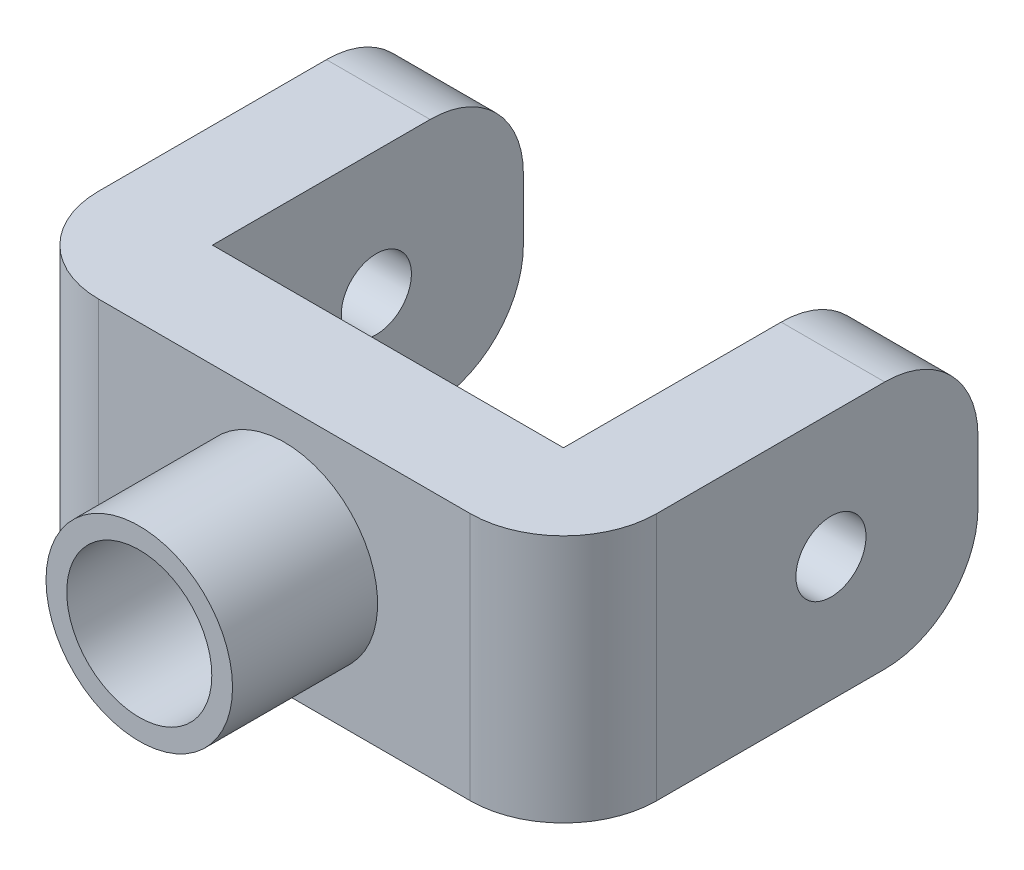
ISO-10303-21;
HEADER;
FILE_DESCRIPTION(('STEP AP214'),'2;1');
FILE_NAME('part.step','',(''),(''),'','','');
FILE_SCHEMA(('AUTOMOTIVE_DESIGN { 1 0 10303 214 1 1 1 1 }'));
ENDSEC;
DATA;
#1=APPLICATION_CONTEXT('core data for automotive mechanical design processes');
#2=APPLICATION_PROTOCOL_DEFINITION('international standard','automotive_design',2000,#1);
#3=PRODUCT_CONTEXT('',#1,'mechanical');
#4=PRODUCT('Part','Part','',(#3));
#5=PRODUCT_RELATED_PRODUCT_CATEGORY('part','',(#4));
#6=PRODUCT_DEFINITION_FORMATION('','',#4);
#7=PRODUCT_DEFINITION_CONTEXT('part definition',#1,'design');
#8=PRODUCT_DEFINITION('design','',#6,#7);
#9=PRODUCT_DEFINITION_SHAPE('','',#8);
#10=(LENGTH_UNIT() NAMED_UNIT(*) SI_UNIT(.MILLI.,.METRE.));
#11=(NAMED_UNIT(*) PLANE_ANGLE_UNIT() SI_UNIT($,.RADIAN.));
#12=(NAMED_UNIT(*) SI_UNIT($,.STERADIAN.) SOLID_ANGLE_UNIT());
#13=UNCERTAINTY_MEASURE_WITH_UNIT(LENGTH_MEASURE(1.E-05),#10,'distance_accuracy_value','');
#14=(GEOMETRIC_REPRESENTATION_CONTEXT(3) GLOBAL_UNCERTAINTY_ASSIGNED_CONTEXT((#13)) GLOBAL_UNIT_ASSIGNED_CONTEXT((#10,
#11,#12)) REPRESENTATION_CONTEXT('',''));
#15=CARTESIAN_POINT('',(0.,0.,0.));
#16=DIRECTION('',(0.,0.,1.));
#17=DIRECTION('',(1.,0.,0.));
#18=AXIS2_PLACEMENT_3D('',#15,#16,#17);
#19=CARTESIAN_POINT('',(26.9354838709678,12.,3.05148045872243));
#20=DIRECTION('',(0.,0.,-1.));
#21=DIRECTION('',(-1.,0.,0.));
#22=AXIS2_PLACEMENT_3D('',#19,#20,#21);
#23=PLANE('',#22);
#24=DIRECTION('',(1.,0.,0.));
#25=VECTOR('',#24,1.);
#26=CARTESIAN_POINT('',(26.9354838709678,12.,3.05148045872243));
#27=LINE('',#26,#25);
#28=CARTESIAN_POINT('',(-17.9354838709678,12.,3.05148045872242));
#29=VERTEX_POINT('',#28);
#30=CARTESIAN_POINT('',(17.9354838709678,12.,3.05148045872243));
#31=VERTEX_POINT('',#30);
#32=EDGE_CURVE('E225',#29,#31,#27,.T.);
#33=ORIENTED_EDGE('',*,*,#32,.F.);
#34=DIRECTION('',(0.,-1.,0.));
#35=VECTOR('',#34,1.);
#36=CARTESIAN_POINT('',(-17.9354838709678,12.,3.05148045872242));
#37=LINE('',#36,#35);
#38=CARTESIAN_POINT('',(-17.9354838709678,-12.,3.05148045872242));
#39=VERTEX_POINT('',#38);
#40=EDGE_CURVE('E215',#29,#39,#37,.T.);
#41=ORIENTED_EDGE('',*,*,#40,.T.);
#42=DIRECTION('',(1.,0.,0.));
#43=VECTOR('',#42,1.);
#44=CARTESIAN_POINT('',(26.9354838709678,-12.,3.05148045872243));
#45=LINE('',#44,#43);
#46=CARTESIAN_POINT('',(17.9354838709678,-12.,3.05148045872243));
#47=VERTEX_POINT('',#46);
#48=EDGE_CURVE('E242',#39,#47,#45,.T.);
#49=ORIENTED_EDGE('',*,*,#48,.T.);
#50=DIRECTION('',(0.,-1.,0.));
#51=VECTOR('',#50,1.);
#52=CARTESIAN_POINT('',(17.9354838709678,12.,3.05148045872243));
#53=LINE('',#52,#51);
#54=EDGE_CURVE('E213',#47,#31,#53,.F.);
#55=ORIENTED_EDGE('',*,*,#54,.T.);
#56=EDGE_LOOP('',(#33,#41,#49,#55));
#57=FACE_BOUND('',#56,.T.);
#58=CARTESIAN_POINT('',(0.,0.,3.05148045872243));
#59=DIRECTION('',(0.,0.,-1.));
#60=DIRECTION('',(-1.,0.,0.));
#61=AXIS2_PLACEMENT_3D('',#58,#59,#60);
#62=CIRCLE('',#61,9.);
#63=CARTESIAN_POINT('',(-9.,0.,3.05148045872242));
#64=VERTEX_POINT('',#63);
#65=EDGE_CURVE('E165',#64,#64,#62,.F.);
#66=ORIENTED_EDGE('',*,*,#65,.F.);
#67=EDGE_LOOP('',(#66));
#68=FACE_BOUND('',#67,.T.);
#69=ADVANCED_FACE('F36',(#57,#68),#23,.F.);
#70=CARTESIAN_POINT('',(16.9354838709678,12.,-6.94851954127757));
#71=DIRECTION('',(1.,0.,0.));
#72=DIRECTION('',(0.,0.,-1.));
#73=AXIS2_PLACEMENT_3D('',#70,#71,#72);
#74=PLANE('',#73);
#75=CARTESIAN_POINT('',(16.9354838709678,0.,-22.7618384998148));
#76=DIRECTION('',(1.,0.,0.));
#77=DIRECTION('',(0.,0.,-1.));
#78=AXIS2_PLACEMENT_3D('',#75,#76,#77);
#79=CIRCLE('',#78,3.38243531338169);
#80=CARTESIAN_POINT('',(16.9354838709678,0.,-26.1442738131964));
#81=VERTEX_POINT('',#80);
#82=EDGE_CURVE('E489',#81,#81,#79,.F.);
#83=ORIENTED_EDGE('',*,*,#82,.F.);
#84=EDGE_LOOP('',(#83));
#85=FACE_BOUND('',#84,.T.);
#86=DIRECTION('',(0.,-1.,0.));
#87=VECTOR('',#86,1.);
#88=CARTESIAN_POINT('',(16.9354838709678,12.,-36.9485195412776));
#89=LINE('',#88,#87);
#90=CARTESIAN_POINT('',(16.9354838709678,3.,-36.9485195412776));
#91=VERTEX_POINT('',#90);
#92=CARTESIAN_POINT('',(16.9354838709678,-3.,-36.9485195412776));
#93=VERTEX_POINT('',#92);
#94=EDGE_CURVE('E254',#91,#93,#89,.T.);
#95=ORIENTED_EDGE('',*,*,#94,.T.);
#96=CARTESIAN_POINT('',(16.9354838709678,-3.,-27.9485195412776));
#97=DIRECTION('',(1.,0.,0.));
#98=DIRECTION('',(0.,0.,-1.));
#99=AXIS2_PLACEMENT_3D('',#96,#97,#98);
#100=CIRCLE('',#99,9.);
#101=CARTESIAN_POINT('',(16.9354838709678,-12.,-27.9485195412776));
#102=VERTEX_POINT('',#101);
#103=EDGE_CURVE('E184',#93,#102,#100,.F.);
#104=ORIENTED_EDGE('',*,*,#103,.T.);
#105=DIRECTION('',(0.,0.,1.));
#106=VECTOR('',#105,1.);
#107=CARTESIAN_POINT('',(16.9354838709678,-12.,-6.94851954127757));
#108=LINE('',#107,#106);
#109=CARTESIAN_POINT('',(16.9354838709678,-12.,-6.94851954127757));
#110=VERTEX_POINT('',#109);
#111=EDGE_CURVE('E163',#102,#110,#108,.T.);
#112=ORIENTED_EDGE('',*,*,#111,.T.);
#113=DIRECTION('',(0.,-1.,0.));
#114=VECTOR('',#113,1.);
#115=CARTESIAN_POINT('',(16.9354838709678,12.,-6.94851954127757));
#116=LINE('',#115,#114);
#117=CARTESIAN_POINT('',(16.9354838709678,12.,-6.94851954127757));
#118=VERTEX_POINT('',#117);
#119=EDGE_CURVE('E154',#118,#110,#116,.T.);
#120=ORIENTED_EDGE('',*,*,#119,.F.);
#121=DIRECTION('',(0.,0.,1.));
#122=VECTOR('',#121,1.);
#123=CARTESIAN_POINT('',(16.9354838709678,12.,-6.94851954127757));
#124=LINE('',#123,#122);
#125=CARTESIAN_POINT('',(16.9354838709678,12.,-27.9485195412776));
#126=VERTEX_POINT('',#125);
#127=EDGE_CURVE('E139',#126,#118,#124,.T.);
#128=ORIENTED_EDGE('',*,*,#127,.F.);
#129=CARTESIAN_POINT('',(16.9354838709678,3.,-27.9485195412776));
#130=DIRECTION('',(1.,0.,0.));
#131=DIRECTION('',(0.,0.,-1.));
#132=AXIS2_PLACEMENT_3D('',#129,#130,#131);
#133=CIRCLE('',#132,9.);
#134=EDGE_CURVE('E182',#126,#91,#133,.F.);
#135=ORIENTED_EDGE('',*,*,#134,.T.);
#136=EDGE_LOOP('',(#95,#104,#112,#120,#128,#135));
#137=FACE_BOUND('',#136,.T.);
#138=ADVANCED_FACE('F161',(#85,#137),#74,.F.);
#139=CARTESIAN_POINT('',(-16.9354838709678,12.,-6.94851954127757));
#140=DIRECTION('',(0.,0.,1.));
#141=DIRECTION('',(1.,0.,0.));
#142=AXIS2_PLACEMENT_3D('',#139,#140,#141);
#143=PLANE('',#142);
#144=CARTESIAN_POINT('',(0.,0.,-6.94851954127757));
#145=DIRECTION('',(0.,0.,1.));
#146=DIRECTION('',(1.,0.,0.));
#147=AXIS2_PLACEMENT_3D('',#144,#145,#146);
#148=CIRCLE('',#147,7.);
#149=CARTESIAN_POINT('',(7.,0.,-6.94851954127757));
#150=VERTEX_POINT('',#149);
#151=EDGE_CURVE('E279',#150,#150,#148,.T.);
#152=ORIENTED_EDGE('',*,*,#151,.T.);
#153=EDGE_LOOP('',(#152));
#154=FACE_BOUND('',#153,.T.);
#155=DIRECTION('',(-1.,0.,0.));
#156=VECTOR('',#155,1.);
#157=CARTESIAN_POINT('',(-16.9354838709678,-12.,-6.94851954127757));
#158=LINE('',#157,#156);
#159=CARTESIAN_POINT('',(-16.9354838709678,-12.,-6.94851954127757));
#160=VERTEX_POINT('',#159);
#161=EDGE_CURVE('E249',#110,#160,#158,.T.);
#162=ORIENTED_EDGE('',*,*,#161,.T.);
#163=DIRECTION('',(0.,-1.,0.));
#164=VECTOR('',#163,1.);
#165=CARTESIAN_POINT('',(-16.9354838709678,12.,-6.94851954127757));
#166=LINE('',#165,#164);
#167=CARTESIAN_POINT('',(-16.9354838709678,12.,-6.94851954127757));
#168=VERTEX_POINT('',#167);
#169=EDGE_CURVE('E156',#168,#160,#166,.T.);
#170=ORIENTED_EDGE('',*,*,#169,.F.);
#171=DIRECTION('',(-1.,0.,0.));
#172=VECTOR('',#171,1.);
#173=CARTESIAN_POINT('',(-16.9354838709678,12.,-6.94851954127757));
#174=LINE('',#173,#172);
#175=EDGE_CURVE('E143',#118,#168,#174,.T.);
#176=ORIENTED_EDGE('',*,*,#175,.F.);
#177=ORIENTED_EDGE('',*,*,#119,.T.);
#178=EDGE_LOOP('',(#162,#170,#176,#177));
#179=FACE_BOUND('',#178,.T.);
#180=ADVANCED_FACE('F153',(#154,#179),#143,.F.);
#181=CARTESIAN_POINT('',(-16.9354838709678,12.,-6.94851954127757));
#182=DIRECTION('',(-1.,0.,0.));
#183=DIRECTION('',(0.,0.,1.));
#184=AXIS2_PLACEMENT_3D('',#181,#182,#183);
#185=PLANE('',#184);
#186=CARTESIAN_POINT('',(-16.9354838709678,0.,-22.7618384998147));
#187=DIRECTION('',(-1.,0.,0.));
#188=DIRECTION('',(0.,0.,1.));
#189=AXIS2_PLACEMENT_3D('',#186,#187,#188);
#190=CIRCLE('',#189,3.38243531338169);
#191=CARTESIAN_POINT('',(-16.9354838709678,0.,-19.379403186433));
#192=VERTEX_POINT('',#191);
#193=EDGE_CURVE('E488',#192,#192,#190,.F.);
#194=ORIENTED_EDGE('',*,*,#193,.F.);
#195=EDGE_LOOP('',(#194));
#196=FACE_BOUND('',#195,.T.);
#197=DIRECTION('',(0.,-1.,0.));
#198=VECTOR('',#197,1.);
#199=CARTESIAN_POINT('',(-16.9354838709677,12.,-36.9485195412776));
#200=LINE('',#199,#198);
#201=CARTESIAN_POINT('',(-16.9354838709677,3.,-36.9485195412776));
#202=VERTEX_POINT('',#201);
#203=CARTESIAN_POINT('',(-16.9354838709677,-3.,-36.9485195412776));
#204=VERTEX_POINT('',#203);
#205=EDGE_CURVE('E170',#202,#204,#200,.T.);
#206=ORIENTED_EDGE('',*,*,#205,.F.);
#207=CARTESIAN_POINT('',(-16.9354838709677,3.,-27.9485195412776));
#208=DIRECTION('',(-1.,0.,0.));
#209=DIRECTION('',(0.,0.,1.));
#210=AXIS2_PLACEMENT_3D('',#207,#208,#209);
#211=CIRCLE('',#210,9.);
#212=CARTESIAN_POINT('',(-16.9354838709677,12.,-27.9485195412776));
#213=VERTEX_POINT('',#212);
#214=EDGE_CURVE('E211',#202,#213,#211,.F.);
#215=ORIENTED_EDGE('',*,*,#214,.T.);
#216=DIRECTION('',(0.,0.,-1.));
#217=VECTOR('',#216,1.);
#218=CARTESIAN_POINT('',(-16.9354838709678,12.,-6.94851954127757));
#219=LINE('',#218,#217);
#220=EDGE_CURVE('E158',#168,#213,#219,.T.);
#221=ORIENTED_EDGE('',*,*,#220,.F.);
#222=ORIENTED_EDGE('',*,*,#169,.T.);
#223=DIRECTION('',(0.,0.,-1.));
#224=VECTOR('',#223,1.);
#225=CARTESIAN_POINT('',(-16.9354838709678,-12.,-6.94851954127757));
#226=LINE('',#225,#224);
#227=CARTESIAN_POINT('',(-16.9354838709677,-12.,-27.9485195412776));
#228=VERTEX_POINT('',#227);
#229=EDGE_CURVE('E245',#160,#228,#226,.T.);
#230=ORIENTED_EDGE('',*,*,#229,.T.);
#231=CARTESIAN_POINT('',(-16.9354838709677,-3.,-27.9485195412776));
#232=DIRECTION('',(-1.,0.,0.));
#233=DIRECTION('',(0.,0.,1.));
#234=AXIS2_PLACEMENT_3D('',#231,#232,#233);
#235=CIRCLE('',#234,9.);
#236=EDGE_CURVE('E209',#228,#204,#235,.F.);
#237=ORIENTED_EDGE('',*,*,#236,.T.);
#238=EDGE_LOOP('',(#206,#215,#221,#222,#230,#237));
#239=FACE_BOUND('',#238,.T.);
#240=ADVANCED_FACE('F273',(#196,#239),#185,.F.);
#241=CARTESIAN_POINT('',(-16.9354838709677,12.,-36.9485195412776));
#242=DIRECTION('',(0.,0.,1.));
#243=DIRECTION('',(1.,0.,0.));
#244=AXIS2_PLACEMENT_3D('',#241,#242,#243);
#245=PLANE('',#244);
#246=DIRECTION('',(0.,-1.,0.));
#247=VECTOR('',#246,1.);
#248=CARTESIAN_POINT('',(-26.9354838709677,12.,-36.9485195412776));
#249=LINE('',#248,#247);
#250=CARTESIAN_POINT('',(-26.9354838709677,3.,-36.9485195412776));
#251=VERTEX_POINT('',#250);
#252=CARTESIAN_POINT('',(-26.9354838709677,-3.,-36.9485195412776));
#253=VERTEX_POINT('',#252);
#254=EDGE_CURVE('E259',#251,#253,#249,.T.);
#255=ORIENTED_EDGE('',*,*,#254,.F.);
#256=DIRECTION('',(-1.,0.,0.));
#257=VECTOR('',#256,1.);
#258=CARTESIAN_POINT('',(-16.9354838709677,3.,-36.9485195412776));
#259=LINE('',#258,#257);
#260=EDGE_CURVE('E207',#251,#202,#259,.F.);
#261=ORIENTED_EDGE('',*,*,#260,.T.);
#262=ORIENTED_EDGE('',*,*,#205,.T.);
#263=DIRECTION('',(-1.,0.,0.));
#264=VECTOR('',#263,1.);
#265=CARTESIAN_POINT('',(-26.9354838709677,-3.,-36.9485195412776));
#266=LINE('',#265,#264);
#267=EDGE_CURVE('E204',#204,#253,#266,.T.);
#268=ORIENTED_EDGE('',*,*,#267,.T.);
#269=EDGE_LOOP('',(#255,#261,#262,#268));
#270=FACE_BOUND('',#269,.T.);
#271=ADVANCED_FACE('F265',(#270),#245,.F.);
#272=CARTESIAN_POINT('',(-26.9354838709677,12.,-36.9485195412776));
#273=DIRECTION('',(1.,0.,0.));
#274=DIRECTION('',(0.,0.,-1.));
#275=AXIS2_PLACEMENT_3D('',#272,#273,#274);
#276=PLANE('',#275);
#277=CARTESIAN_POINT('',(-26.9354838709678,0.,-22.7618384998147));
#278=DIRECTION('',(1.,0.,0.));
#279=DIRECTION('',(0.,0.,-1.));
#280=AXIS2_PLACEMENT_3D('',#277,#278,#279);
#281=CIRCLE('',#280,3.38243531338169);
#282=CARTESIAN_POINT('',(-26.9354838709678,0.,-26.1442738131964));
#283=VERTEX_POINT('',#282);
#284=EDGE_CURVE('E177',#283,#283,#281,.F.);
#285=ORIENTED_EDGE('',*,*,#284,.F.);
#286=EDGE_LOOP('',(#285));
#287=FACE_BOUND('',#286,.T.);
#288=DIRECTION('',(0.,0.,1.));
#289=VECTOR('',#288,1.);
#290=CARTESIAN_POINT('',(-26.9354838709677,-12.,-36.9485195412776));
#291=LINE('',#290,#289);
#292=CARTESIAN_POINT('',(-26.9354838709677,-12.,-27.9485195412776));
#293=VERTEX_POINT('',#292);
#294=CARTESIAN_POINT('',(-26.9354838709678,-12.,-5.94851954127758));
#295=VERTEX_POINT('',#294);
#296=EDGE_CURVE('E240',#293,#295,#291,.T.);
#297=ORIENTED_EDGE('',*,*,#296,.T.);
#298=DIRECTION('',(0.,-1.,0.));
#299=VECTOR('',#298,1.);
#300=CARTESIAN_POINT('',(-26.9354838709678,12.,-5.94851954127758));
#301=LINE('',#300,#299);
#302=CARTESIAN_POINT('',(-26.9354838709678,12.,-5.94851954127758));
#303=VERTEX_POINT('',#302);
#304=EDGE_CURVE('E59',#295,#303,#301,.F.);
#305=ORIENTED_EDGE('',*,*,#304,.T.);
#306=DIRECTION('',(0.,0.,1.));
#307=VECTOR('',#306,1.);
#308=CARTESIAN_POINT('',(-26.9354838709677,12.,-36.9485195412776));
#309=LINE('',#308,#307);
#310=CARTESIAN_POINT('',(-26.9354838709677,12.,-27.9485195412776));
#311=VERTEX_POINT('',#310);
#312=EDGE_CURVE('E226',#311,#303,#309,.T.);
#313=ORIENTED_EDGE('',*,*,#312,.F.);
#314=CARTESIAN_POINT('',(-26.9354838709677,3.,-27.9485195412776));
#315=DIRECTION('',(1.,0.,0.));
#316=DIRECTION('',(0.,0.,-1.));
#317=AXIS2_PLACEMENT_3D('',#314,#315,#316);
#318=CIRCLE('',#317,9.);
#319=EDGE_CURVE('E202',#311,#251,#318,.F.);
#320=ORIENTED_EDGE('',*,*,#319,.T.);
#321=ORIENTED_EDGE('',*,*,#254,.T.);
#322=CARTESIAN_POINT('',(-26.9354838709678,-3.,-27.9485195412776));
#323=DIRECTION('',(1.,0.,0.));
#324=DIRECTION('',(0.,0.,-1.));
#325=AXIS2_PLACEMENT_3D('',#322,#323,#324);
#326=CIRCLE('',#325,9.);
#327=EDGE_CURVE('E200',#253,#293,#326,.F.);
#328=ORIENTED_EDGE('',*,*,#327,.T.);
#329=EDGE_LOOP('',(#297,#305,#313,#320,#321,#328));
#330=FACE_BOUND('',#329,.T.);
#331=ADVANCED_FACE('F243',(#287,#330),#276,.F.);
#332=CARTESIAN_POINT('',(26.9354838709677,12.,-36.9485195412776));
#333=DIRECTION('',(-1.,0.,0.));
#334=DIRECTION('',(0.,0.,1.));
#335=AXIS2_PLACEMENT_3D('',#332,#333,#334);
#336=PLANE('',#335);
#337=CARTESIAN_POINT('',(26.9354838709678,0.,-22.7618384998148));
#338=DIRECTION('',(-1.,0.,0.));
#339=DIRECTION('',(0.,0.,1.));
#340=AXIS2_PLACEMENT_3D('',#337,#338,#339);
#341=CIRCLE('',#340,3.38243531338169);
#342=CARTESIAN_POINT('',(26.9354838709678,0.,-19.3794031864331));
#343=VERTEX_POINT('',#342);
#344=EDGE_CURVE('E174',#343,#343,#341,.F.);
#345=ORIENTED_EDGE('',*,*,#344,.F.);
#346=EDGE_LOOP('',(#345));
#347=FACE_BOUND('',#346,.T.);
#348=DIRECTION('',(0.,0.,-1.));
#349=VECTOR('',#348,1.);
#350=CARTESIAN_POINT('',(26.9354838709677,12.,-36.9485195412776));
#351=LINE('',#350,#349);
#352=CARTESIAN_POINT('',(26.9354838709678,12.,-5.94851954127757));
#353=VERTEX_POINT('',#352);
#354=CARTESIAN_POINT('',(26.9354838709677,12.,-27.9485195412776));
#355=VERTEX_POINT('',#354);
#356=EDGE_CURVE('E234',#353,#355,#351,.T.);
#357=ORIENTED_EDGE('',*,*,#356,.F.);
#358=DIRECTION('',(0.,-1.,0.));
#359=VECTOR('',#358,1.);
#360=CARTESIAN_POINT('',(26.9354838709678,12.,-5.94851954127757));
#361=LINE('',#360,#359);
#362=CARTESIAN_POINT('',(26.9354838709678,-12.,-5.94851954127757));
#363=VERTEX_POINT('',#362);
#364=EDGE_CURVE('E11',#353,#363,#361,.T.);
#365=ORIENTED_EDGE('',*,*,#364,.T.);
#366=DIRECTION('',(0.,0.,-1.));
#367=VECTOR('',#366,1.);
#368=CARTESIAN_POINT('',(26.9354838709677,-12.,-36.9485195412776));
#369=LINE('',#368,#367);
#370=CARTESIAN_POINT('',(26.9354838709677,-12.,-27.9485195412776));
#371=VERTEX_POINT('',#370);
#372=EDGE_CURVE('E149',#363,#371,#369,.T.);
#373=ORIENTED_EDGE('',*,*,#372,.T.);
#374=CARTESIAN_POINT('',(26.9354838709678,-3.,-27.9485195412776));
#375=DIRECTION('',(-1.,0.,0.));
#376=DIRECTION('',(0.,0.,1.));
#377=AXIS2_PLACEMENT_3D('',#374,#375,#376);
#378=CIRCLE('',#377,9.);
#379=CARTESIAN_POINT('',(26.9354838709677,-3.,-36.9485195412776));
#380=VERTEX_POINT('',#379);
#381=EDGE_CURVE('E194',#371,#380,#378,.F.);
#382=ORIENTED_EDGE('',*,*,#381,.T.);
#383=DIRECTION('',(0.,-1.,0.));
#384=VECTOR('',#383,1.);
#385=CARTESIAN_POINT('',(26.9354838709677,12.,-36.9485195412776));
#386=LINE('',#385,#384);
#387=CARTESIAN_POINT('',(26.9354838709677,3.,-36.9485195412776));
#388=VERTEX_POINT('',#387);
#389=EDGE_CURVE('E256',#388,#380,#386,.T.);
#390=ORIENTED_EDGE('',*,*,#389,.F.);
#391=CARTESIAN_POINT('',(26.9354838709677,3.,-27.9485195412776));
#392=DIRECTION('',(-1.,0.,0.));
#393=DIRECTION('',(0.,0.,1.));
#394=AXIS2_PLACEMENT_3D('',#391,#392,#393);
#395=CIRCLE('',#394,9.);
#396=EDGE_CURVE('E191',#388,#355,#395,.F.);
#397=ORIENTED_EDGE('',*,*,#396,.T.);
#398=EDGE_LOOP('',(#357,#365,#373,#382,#390,#397));
#399=FACE_BOUND('',#398,.T.);
#400=ADVANCED_FACE('F288',(#347,#399),#336,.F.);
#401=CARTESIAN_POINT('',(16.9354838709678,12.,-36.9485195412776));
#402=DIRECTION('',(0.,0.,1.));
#403=DIRECTION('',(1.,0.,0.));
#404=AXIS2_PLACEMENT_3D('',#401,#402,#403);
#405=PLANE('',#404);
#406=ORIENTED_EDGE('',*,*,#389,.T.);
#407=DIRECTION('',(-1.,0.,0.));
#408=VECTOR('',#407,1.);
#409=CARTESIAN_POINT('',(16.9354838709678,-3.,-36.9485195412776));
#410=LINE('',#409,#408);
#411=EDGE_CURVE('E179',#380,#93,#410,.T.);
#412=ORIENTED_EDGE('',*,*,#411,.T.);
#413=ORIENTED_EDGE('',*,*,#94,.F.);
#414=DIRECTION('',(-1.,0.,0.));
#415=VECTOR('',#414,1.);
#416=CARTESIAN_POINT('',(16.9354838709678,3.,-36.9485195412776));
#417=LINE('',#416,#415);
#418=EDGE_CURVE('E168',#91,#388,#417,.F.);
#419=ORIENTED_EDGE('',*,*,#418,.T.);
#420=EDGE_LOOP('',(#406,#412,#413,#419));
#421=FACE_BOUND('',#420,.T.);
#422=ADVANCED_FACE('F291',(#421),#405,.F.);
#423=CARTESIAN_POINT('',(0.,12.,0.));
#424=DIRECTION('',(0.,-1.,0.));
#425=DIRECTION('',(0.,0.,-1.));
#426=AXIS2_PLACEMENT_3D('',#423,#424,#425);
#427=PLANE('',#426);
#428=ORIENTED_EDGE('',*,*,#312,.T.);
#429=CARTESIAN_POINT('',(-17.9354838709678,12.,-5.94851954127758));
#430=DIRECTION('',(0.,-1.,0.));
#431=DIRECTION('',(0.,0.,-1.));
#432=AXIS2_PLACEMENT_3D('',#429,#430,#431);
#433=CIRCLE('',#432,9.);
#434=EDGE_CURVE('E44',#303,#29,#433,.F.);
#435=ORIENTED_EDGE('',*,*,#434,.T.);
#436=ORIENTED_EDGE('',*,*,#32,.T.);
#437=CARTESIAN_POINT('',(17.9354838709678,12.,-5.94851954127757));
#438=DIRECTION('',(0.,-1.,0.));
#439=DIRECTION('',(0.,0.,-1.));
#440=AXIS2_PLACEMENT_3D('',#437,#438,#439);
#441=CIRCLE('',#440,9.);
#442=EDGE_CURVE('E51',#31,#353,#441,.F.);
#443=ORIENTED_EDGE('',*,*,#442,.T.);
#444=ORIENTED_EDGE('',*,*,#356,.T.);
#445=DIRECTION('',(-1.,0.,0.));
#446=VECTOR('',#445,1.);
#447=CARTESIAN_POINT('',(0.,12.,-27.9485195412776));
#448=LINE('',#447,#446);
#449=EDGE_CURVE('E146',#355,#126,#448,.T.);
#450=ORIENTED_EDGE('',*,*,#449,.T.);
#451=ORIENTED_EDGE('',*,*,#127,.T.);
#452=ORIENTED_EDGE('',*,*,#175,.T.);
#453=ORIENTED_EDGE('',*,*,#220,.T.);
#454=DIRECTION('',(-1.,0.,0.));
#455=VECTOR('',#454,1.);
#456=CARTESIAN_POINT('',(0.,12.,-27.9485195412776));
#457=LINE('',#456,#455);
#458=EDGE_CURVE('E196',#213,#311,#457,.T.);
#459=ORIENTED_EDGE('',*,*,#458,.T.);
#460=EDGE_LOOP('',(#428,#435,#436,#443,#444,#450,#451,#452,#453,#459));
#461=FACE_BOUND('',#460,.T.);
#462=ADVANCED_FACE('F141',(#461),#427,.F.);
#463=CARTESIAN_POINT('',(0.,-12.,0.));
#464=DIRECTION('',(0.,-1.,0.));
#465=DIRECTION('',(0.,0.,-1.));
#466=AXIS2_PLACEMENT_3D('',#463,#464,#465);
#467=PLANE('',#466);
#468=ORIENTED_EDGE('',*,*,#48,.F.);
#469=CARTESIAN_POINT('',(-17.9354838709678,-12.,-5.94851954127758));
#470=DIRECTION('',(0.,-1.,0.));
#471=DIRECTION('',(0.,0.,-1.));
#472=AXIS2_PLACEMENT_3D('',#469,#470,#471);
#473=CIRCLE('',#472,9.);
#474=EDGE_CURVE('E220',#39,#295,#473,.T.);
#475=ORIENTED_EDGE('',*,*,#474,.T.);
#476=ORIENTED_EDGE('',*,*,#296,.F.);
#477=DIRECTION('',(-1.,0.,0.));
#478=VECTOR('',#477,1.);
#479=CARTESIAN_POINT('',(-16.9354838709677,-12.,-27.9485195412776));
#480=LINE('',#479,#478);
#481=EDGE_CURVE('E186',#293,#228,#480,.F.);
#482=ORIENTED_EDGE('',*,*,#481,.T.);
#483=ORIENTED_EDGE('',*,*,#229,.F.);
#484=ORIENTED_EDGE('',*,*,#161,.F.);
#485=ORIENTED_EDGE('',*,*,#111,.F.);
#486=DIRECTION('',(-1.,0.,0.));
#487=VECTOR('',#486,1.);
#488=CARTESIAN_POINT('',(26.9354838709677,-12.,-27.9485195412776));
#489=LINE('',#488,#487);
#490=EDGE_CURVE('E188',#102,#371,#489,.F.);
#491=ORIENTED_EDGE('',*,*,#490,.T.);
#492=ORIENTED_EDGE('',*,*,#372,.F.);
#493=CARTESIAN_POINT('',(17.9354838709678,-12.,-5.94851954127757));
#494=DIRECTION('',(0.,-1.,0.));
#495=DIRECTION('',(0.,0.,-1.));
#496=AXIS2_PLACEMENT_3D('',#493,#494,#495);
#497=CIRCLE('',#496,9.);
#498=EDGE_CURVE('E218',#363,#47,#497,.T.);
#499=ORIENTED_EDGE('',*,*,#498,.T.);
#500=EDGE_LOOP('',(#468,#475,#476,#482,#483,#484,#485,#491,#492,#499));
#501=FACE_BOUND('',#500,.T.);
#502=ADVANCED_FACE('F239',(#501),#467,.T.);
#503=CARTESIAN_POINT('',(0.,0.,-13.9485195412776));
#504=DIRECTION('',(0.,0.,1.));
#505=DIRECTION('',(1.,0.,0.));
#506=AXIS2_PLACEMENT_3D('',#503,#504,#505);
#507=CYLINDRICAL_SURFACE('',#506,7.);
#508=ORIENTED_EDGE('',*,*,#151,.F.);
#509=EDGE_LOOP('',(#508));
#510=FACE_BOUND('',#509,.T.);
#511=CARTESIAN_POINT('',(0.,0.,17.0514804587224));
#512=DIRECTION('',(0.,0.,1.));
#513=DIRECTION('',(1.,0.,0.));
#514=AXIS2_PLACEMENT_3D('',#511,#512,#513);
#515=CIRCLE('',#514,7.);
#516=CARTESIAN_POINT('',(7.,0.,17.0514804587224));
#517=VERTEX_POINT('',#516);
#518=EDGE_CURVE('E492',#517,#517,#515,.T.);
#519=ORIENTED_EDGE('',*,*,#518,.T.);
#520=EDGE_LOOP('',(#519));
#521=FACE_BOUND('',#520,.T.);
#522=ADVANCED_FACE('F354',(#510,#521),#507,.F.);
#523=CARTESIAN_POINT('',(0.,0.,17.0514804587224));
#524=DIRECTION('',(0.,0.,1.));
#525=DIRECTION('',(1.,0.,0.));
#526=AXIS2_PLACEMENT_3D('',#523,#524,#525);
#527=PLANE('',#526);
#528=CARTESIAN_POINT('',(0.,0.,17.0514804587224));
#529=DIRECTION('',(0.,0.,1.));
#530=DIRECTION('',(1.,0.,0.));
#531=AXIS2_PLACEMENT_3D('',#528,#529,#530);
#532=CIRCLE('',#531,9.);
#533=CARTESIAN_POINT('',(9.,0.,17.0514804587224));
#534=VERTEX_POINT('',#533);
#535=EDGE_CURVE('E498',#534,#534,#532,.T.);
#536=ORIENTED_EDGE('',*,*,#535,.T.);
#537=EDGE_LOOP('',(#536));
#538=FACE_BOUND('',#537,.T.);
#539=ORIENTED_EDGE('',*,*,#518,.F.);
#540=EDGE_LOOP('',(#539));
#541=FACE_BOUND('',#540,.T.);
#542=ADVANCED_FACE('F396',(#538,#541),#527,.T.);
#543=CARTESIAN_POINT('',(0.,0.,17.0514804587224));
#544=DIRECTION('',(0.,0.,-1.));
#545=DIRECTION('',(-1.,0.,0.));
#546=AXIS2_PLACEMENT_3D('',#543,#544,#545);
#547=CYLINDRICAL_SURFACE('',#546,9.);
#548=ORIENTED_EDGE('',*,*,#535,.F.);
#549=EDGE_LOOP('',(#548));
#550=FACE_BOUND('',#549,.T.);
#551=ORIENTED_EDGE('',*,*,#65,.T.);
#552=EDGE_LOOP('',(#551));
#553=FACE_BOUND('',#552,.T.);
#554=ADVANCED_FACE('F406',(#550,#553),#547,.T.);
#555=CARTESIAN_POINT('',(42.9354838709678,0.,-22.7618384998148));
#556=DIRECTION('',(-1.,0.,0.));
#557=DIRECTION('',(0.,0.,1.));
#558=AXIS2_PLACEMENT_3D('',#555,#556,#557);
#559=CYLINDRICAL_SURFACE('',#558,3.38243531338169);
#560=ORIENTED_EDGE('',*,*,#344,.T.);
#561=EDGE_LOOP('',(#560));
#562=FACE_BOUND('',#561,.T.);
#563=ORIENTED_EDGE('',*,*,#82,.T.);
#564=EDGE_LOOP('',(#563));
#565=FACE_BOUND('',#564,.T.);
#566=ADVANCED_FACE('F415',(#562,#565),#559,.F.);
#567=ORIENTED_EDGE('',*,*,#284,.T.);
#568=EDGE_LOOP('',(#567));
#569=FACE_BOUND('',#568,.T.);
#570=ORIENTED_EDGE('',*,*,#193,.T.);
#571=EDGE_LOOP('',(#570));
#572=FACE_BOUND('',#571,.T.);
#573=ADVANCED_FACE('F325',(#569,#572),#559,.F.);
#574=CARTESIAN_POINT('',(16.9354838709678,-3.,-27.9485195412776));
#575=DIRECTION('',(1.,0.,0.));
#576=DIRECTION('',(0.,0.,-1.));
#577=AXIS2_PLACEMENT_3D('',#574,#575,#576);
#578=CYLINDRICAL_SURFACE('',#577,9.);
#579=ORIENTED_EDGE('',*,*,#381,.F.);
#580=ORIENTED_EDGE('',*,*,#490,.F.);
#581=ORIENTED_EDGE('',*,*,#103,.F.);
#582=ORIENTED_EDGE('',*,*,#411,.F.);
#583=EDGE_LOOP('',(#579,#580,#581,#582));
#584=FACE_BOUND('',#583,.T.);
#585=ADVANCED_FACE('F284',(#584),#578,.T.);
#586=CARTESIAN_POINT('',(0.,3.,-27.9485195412776));
#587=DIRECTION('',(-1.,0.,0.));
#588=DIRECTION('',(0.,0.,1.));
#589=AXIS2_PLACEMENT_3D('',#586,#587,#588);
#590=CYLINDRICAL_SURFACE('',#589,9.);
#591=ORIENTED_EDGE('',*,*,#396,.F.);
#592=ORIENTED_EDGE('',*,*,#418,.F.);
#593=ORIENTED_EDGE('',*,*,#134,.F.);
#594=ORIENTED_EDGE('',*,*,#449,.F.);
#595=EDGE_LOOP('',(#591,#592,#593,#594));
#596=FACE_BOUND('',#595,.T.);
#597=ADVANCED_FACE('F295',(#596),#590,.T.);
#598=CARTESIAN_POINT('',(0.,3.,-27.9485195412776));
#599=DIRECTION('',(-1.,0.,0.));
#600=DIRECTION('',(0.,0.,1.));
#601=AXIS2_PLACEMENT_3D('',#598,#599,#600);
#602=CYLINDRICAL_SURFACE('',#601,9.);
#603=ORIENTED_EDGE('',*,*,#214,.F.);
#604=ORIENTED_EDGE('',*,*,#260,.F.);
#605=ORIENTED_EDGE('',*,*,#319,.F.);
#606=ORIENTED_EDGE('',*,*,#458,.F.);
#607=EDGE_LOOP('',(#603,#604,#605,#606));
#608=FACE_BOUND('',#607,.T.);
#609=ADVANCED_FACE('F328',(#608),#602,.T.);
#610=CARTESIAN_POINT('',(-16.9354838709677,-3.,-27.9485195412776));
#611=DIRECTION('',(1.,0.,0.));
#612=DIRECTION('',(0.,0.,-1.));
#613=AXIS2_PLACEMENT_3D('',#610,#611,#612);
#614=CYLINDRICAL_SURFACE('',#613,9.);
#615=ORIENTED_EDGE('',*,*,#236,.F.);
#616=ORIENTED_EDGE('',*,*,#481,.F.);
#617=ORIENTED_EDGE('',*,*,#327,.F.);
#618=ORIENTED_EDGE('',*,*,#267,.F.);
#619=EDGE_LOOP('',(#615,#616,#617,#618));
#620=FACE_BOUND('',#619,.T.);
#621=ADVANCED_FACE('F271',(#620),#614,.T.);
#622=CARTESIAN_POINT('',(-17.9354838709678,12.,-5.94851954127758));
#623=DIRECTION('',(0.,-1.,0.));
#624=DIRECTION('',(0.,0.,-1.));
#625=AXIS2_PLACEMENT_3D('',#622,#623,#624);
#626=CYLINDRICAL_SURFACE('',#625,9.);
#627=ORIENTED_EDGE('',*,*,#434,.F.);
#628=ORIENTED_EDGE('',*,*,#304,.F.);
#629=ORIENTED_EDGE('',*,*,#474,.F.);
#630=ORIENTED_EDGE('',*,*,#40,.F.);
#631=EDGE_LOOP('',(#627,#628,#629,#630));
#632=FACE_BOUND('',#631,.T.);
#633=ADVANCED_FACE('F236',(#632),#626,.T.);
#634=CARTESIAN_POINT('',(17.9354838709678,12.,-5.94851954127757));
#635=DIRECTION('',(0.,-1.,0.));
#636=DIRECTION('',(0.,0.,-1.));
#637=AXIS2_PLACEMENT_3D('',#634,#635,#636);
#638=CYLINDRICAL_SURFACE('',#637,9.);
#639=ORIENTED_EDGE('',*,*,#442,.F.);
#640=ORIENTED_EDGE('',*,*,#54,.F.);
#641=ORIENTED_EDGE('',*,*,#498,.F.);
#642=ORIENTED_EDGE('',*,*,#364,.F.);
#643=EDGE_LOOP('',(#639,#640,#641,#642));
#644=FACE_BOUND('',#643,.T.);
#645=ADVANCED_FACE('F38',(#644),#638,.T.);
#646=CLOSED_SHELL('',(#69,#138,#180,#240,#271,#331,#400,#422,#462,#502,#522,#542,#554,#566,#573,
#585,#597,#609,#621,#633,#645));
#647=MANIFOLD_SOLID_BREP('B2',#646);
#648=ADVANCED_BREP_SHAPE_REPRESENTATION('',(#18,#647),#14);
#649=SHAPE_DEFINITION_REPRESENTATION(#9,#648);
ENDSEC;
END-ISO-10303-21;
